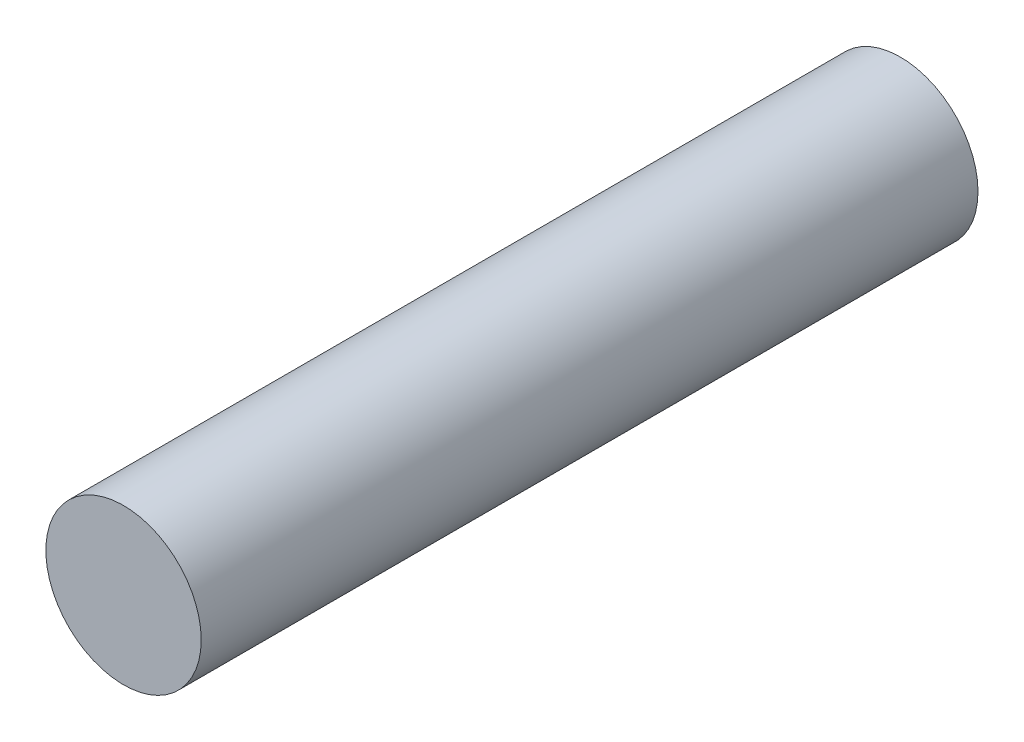
ISO-10303-21;
HEADER;
FILE_DESCRIPTION(('STEP AP214'),'2;1');
FILE_NAME('part.step','',(''),(''),'','','');
FILE_SCHEMA(('AUTOMOTIVE_DESIGN { 1 0 10303 214 1 1 1 1 }'));
ENDSEC;
DATA;
#1=APPLICATION_CONTEXT('core data for automotive mechanical design processes');
#2=APPLICATION_PROTOCOL_DEFINITION('international standard','automotive_design',2000,#1);
#3=PRODUCT_CONTEXT('',#1,'mechanical');
#4=PRODUCT('Part','Part','',(#3));
#5=PRODUCT_RELATED_PRODUCT_CATEGORY('part','',(#4));
#6=PRODUCT_DEFINITION_FORMATION('','',#4);
#7=PRODUCT_DEFINITION_CONTEXT('part definition',#1,'design');
#8=PRODUCT_DEFINITION('design','',#6,#7);
#9=PRODUCT_DEFINITION_SHAPE('','',#8);
#10=(LENGTH_UNIT() NAMED_UNIT(*) SI_UNIT(.MILLI.,.METRE.));
#11=(NAMED_UNIT(*) PLANE_ANGLE_UNIT() SI_UNIT($,.RADIAN.));
#12=(NAMED_UNIT(*) SI_UNIT($,.STERADIAN.) SOLID_ANGLE_UNIT());
#13=UNCERTAINTY_MEASURE_WITH_UNIT(LENGTH_MEASURE(1.E-05),#10,'distance_accuracy_value','');
#14=(GEOMETRIC_REPRESENTATION_CONTEXT(3) GLOBAL_UNCERTAINTY_ASSIGNED_CONTEXT((#13)) GLOBAL_UNIT_ASSIGNED_CONTEXT((#10,
#11,#12)) REPRESENTATION_CONTEXT('',''));
#15=CARTESIAN_POINT('',(0.,0.,0.));
#16=DIRECTION('',(0.,0.,1.));
#17=DIRECTION('',(1.,0.,0.));
#18=AXIS2_PLACEMENT_3D('',#15,#16,#17);
#19=CARTESIAN_POINT('',(0.,0.,5.));
#20=DIRECTION('',(0.,0.,-1.));
#21=DIRECTION('',(-1.,0.,0.));
#22=AXIS2_PLACEMENT_3D('',#19,#20,#21);
#23=CYLINDRICAL_SURFACE('',#22,0.5);
#24=CARTESIAN_POINT('',(0.,0.,5.));
#25=DIRECTION('',(0.,0.,1.));
#26=DIRECTION('',(1.,0.,0.));
#27=AXIS2_PLACEMENT_3D('',#24,#25,#26);
#28=CIRCLE('',#27,0.5);
#29=CARTESIAN_POINT('',(0.5,0.,5.));
#30=VERTEX_POINT('',#29);
#31=EDGE_CURVE('E10',#30,#30,#28,.T.);
#32=ORIENTED_EDGE('',*,*,#31,.F.);
#33=EDGE_LOOP('',(#32));
#34=FACE_BOUND('',#33,.T.);
#35=CARTESIAN_POINT('',(0.,0.,0.));
#36=DIRECTION('',(0.,0.,1.));
#37=DIRECTION('',(1.,0.,0.));
#38=AXIS2_PLACEMENT_3D('',#35,#36,#37);
#39=CIRCLE('',#38,0.5);
#40=CARTESIAN_POINT('',(0.5,0.,0.));
#41=VERTEX_POINT('',#40);
#42=EDGE_CURVE('E40',#41,#41,#39,.T.);
#43=ORIENTED_EDGE('',*,*,#42,.T.);
#44=EDGE_LOOP('',(#43));
#45=FACE_BOUND('',#44,.T.);
#46=ADVANCED_FACE('F37',(#34,#45),#23,.T.);
#47=CARTESIAN_POINT('',(0.,0.,5.));
#48=DIRECTION('',(0.,0.,1.));
#49=DIRECTION('',(1.,0.,0.));
#50=AXIS2_PLACEMENT_3D('',#47,#48,#49);
#51=PLANE('',#50);
#52=ORIENTED_EDGE('',*,*,#31,.T.);
#53=EDGE_LOOP('',(#52));
#54=FACE_BOUND('',#53,.T.);
#55=ADVANCED_FACE('F52',(#54),#51,.T.);
#56=CARTESIAN_POINT('',(0.,0.,0.));
#57=DIRECTION('',(0.,0.,1.));
#58=DIRECTION('',(1.,0.,0.));
#59=AXIS2_PLACEMENT_3D('',#56,#57,#58);
#60=PLANE('',#59);
#61=ORIENTED_EDGE('',*,*,#42,.F.);
#62=EDGE_LOOP('',(#61));
#63=FACE_BOUND('',#62,.T.);
#64=ADVANCED_FACE('F50',(#63),#60,.F.);
#65=CLOSED_SHELL('',(#46,#55,#64));
#66=MANIFOLD_SOLID_BREP('B2',#65);
#67=ADVANCED_BREP_SHAPE_REPRESENTATION('',(#18,#66),#14);
#68=SHAPE_DEFINITION_REPRESENTATION(#9,#67);
ENDSEC;
END-ISO-10303-21;
